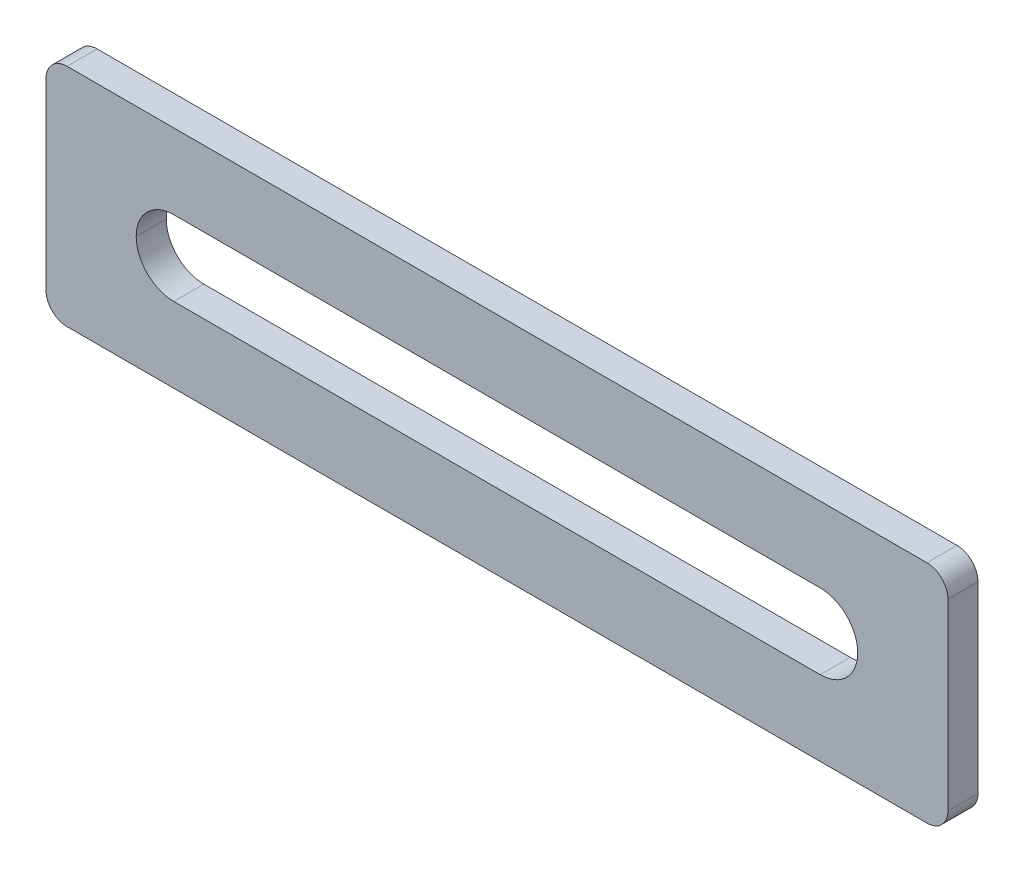
ISO-10303-21;
HEADER;
FILE_DESCRIPTION(('STEP AP214'),'2;1');
FILE_NAME('part.step','',(''),(''),'','','');
FILE_SCHEMA(('AUTOMOTIVE_DESIGN { 1 0 10303 214 1 1 1 1 }'));
ENDSEC;
DATA;
#1=APPLICATION_CONTEXT('core data for automotive mechanical design processes');
#2=APPLICATION_PROTOCOL_DEFINITION('international standard','automotive_design',2000,#1);
#3=PRODUCT_CONTEXT('',#1,'mechanical');
#4=PRODUCT('Part','Part','',(#3));
#5=PRODUCT_RELATED_PRODUCT_CATEGORY('part','',(#4));
#6=PRODUCT_DEFINITION_FORMATION('','',#4);
#7=PRODUCT_DEFINITION_CONTEXT('part definition',#1,'design');
#8=PRODUCT_DEFINITION('design','',#6,#7);
#9=PRODUCT_DEFINITION_SHAPE('','',#8);
#10=(LENGTH_UNIT() NAMED_UNIT(*) SI_UNIT(.MILLI.,.METRE.));
#11=(NAMED_UNIT(*) PLANE_ANGLE_UNIT() SI_UNIT($,.RADIAN.));
#12=(NAMED_UNIT(*) SI_UNIT($,.STERADIAN.) SOLID_ANGLE_UNIT());
#13=UNCERTAINTY_MEASURE_WITH_UNIT(LENGTH_MEASURE(1.E-05),#10,'distance_accuracy_value','');
#14=(GEOMETRIC_REPRESENTATION_CONTEXT(3) GLOBAL_UNCERTAINTY_ASSIGNED_CONTEXT((#13)) GLOBAL_UNIT_ASSIGNED_CONTEXT((#10,
#11,#12)) REPRESENTATION_CONTEXT('',''));
#15=CARTESIAN_POINT('',(0.,0.,0.));
#16=DIRECTION('',(0.,0.,1.));
#17=DIRECTION('',(1.,0.,0.));
#18=AXIS2_PLACEMENT_3D('',#15,#16,#17);
#19=CARTESIAN_POINT('',(0.,0.,2.54));
#20=DIRECTION('',(1.,0.,0.));
#21=DIRECTION('',(0.,0.,-1.));
#22=AXIS2_PLACEMENT_3D('',#19,#20,#21);
#23=PLANE('',#22);
#24=DIRECTION('',(0.,-1.,0.));
#25=VECTOR('',#24,1.);
#26=CARTESIAN_POINT('',(0.,0.,2.54));
#27=LINE('',#26,#25);
#28=CARTESIAN_POINT('',(0.,17.272,2.54));
#29=VERTEX_POINT('',#28);
#30=CARTESIAN_POINT('',(0.,1.778,2.54));
#31=VERTEX_POINT('',#30);
#32=EDGE_CURVE('E174',#29,#31,#27,.T.);
#33=ORIENTED_EDGE('',*,*,#32,.F.);
#34=DIRECTION('',(0.,0.,-1.));
#35=VECTOR('',#34,1.);
#36=CARTESIAN_POINT('',(0.,17.272,2.54));
#37=LINE('',#36,#35);
#38=CARTESIAN_POINT('',(0.,17.272,0.));
#39=VERTEX_POINT('',#38);
#40=EDGE_CURVE('E215',#29,#39,#37,.T.);
#41=ORIENTED_EDGE('',*,*,#40,.T.);
#42=DIRECTION('',(0.,-1.,0.));
#43=VECTOR('',#42,1.);
#44=CARTESIAN_POINT('',(0.,0.,0.));
#45=LINE('',#44,#43);
#46=CARTESIAN_POINT('',(0.,1.778,0.));
#47=VERTEX_POINT('',#46);
#48=EDGE_CURVE('E184',#39,#47,#45,.T.);
#49=ORIENTED_EDGE('',*,*,#48,.T.);
#50=DIRECTION('',(0.,0.,-1.));
#51=VECTOR('',#50,1.);
#52=CARTESIAN_POINT('',(0.,1.778,2.54));
#53=LINE('',#52,#51);
#54=EDGE_CURVE('E210',#47,#31,#53,.F.);
#55=ORIENTED_EDGE('',*,*,#54,.T.);
#56=EDGE_LOOP('',(#33,#41,#49,#55));
#57=FACE_BOUND('',#56,.T.);
#58=ADVANCED_FACE('F33',(#57),#23,.F.);
#59=CARTESIAN_POINT('',(0.,0.,2.54));
#60=DIRECTION('',(0.,1.,0.));
#61=DIRECTION('',(0.,0.,1.));
#62=AXIS2_PLACEMENT_3D('',#59,#60,#61);
#63=PLANE('',#62);
#64=DIRECTION('',(1.,0.,0.));
#65=VECTOR('',#64,1.);
#66=CARTESIAN_POINT('',(0.,0.,2.54));
#67=LINE('',#66,#65);
#68=CARTESIAN_POINT('',(1.778,0.,2.54));
#69=VERTEX_POINT('',#68);
#70=CARTESIAN_POINT('',(74.422,0.,2.54));
#71=VERTEX_POINT('',#70);
#72=EDGE_CURVE('E177',#69,#71,#67,.T.);
#73=ORIENTED_EDGE('',*,*,#72,.F.);
#74=DIRECTION('',(0.,0.,-1.));
#75=VECTOR('',#74,1.);
#76=CARTESIAN_POINT('',(1.778,0.,2.54));
#77=LINE('',#76,#75);
#78=CARTESIAN_POINT('',(1.778,0.,0.));
#79=VERTEX_POINT('',#78);
#80=EDGE_CURVE('E240',#69,#79,#77,.T.);
#81=ORIENTED_EDGE('',*,*,#80,.T.);
#82=DIRECTION('',(1.,0.,0.));
#83=VECTOR('',#82,1.);
#84=CARTESIAN_POINT('',(0.,0.,0.));
#85=LINE('',#84,#83);
#86=CARTESIAN_POINT('',(74.422,0.,0.));
#87=VERTEX_POINT('',#86);
#88=EDGE_CURVE('E187',#79,#87,#85,.T.);
#89=ORIENTED_EDGE('',*,*,#88,.T.);
#90=DIRECTION('',(0.,0.,-1.));
#91=VECTOR('',#90,1.);
#92=CARTESIAN_POINT('',(74.422,0.,2.54));
#93=LINE('',#92,#91);
#94=EDGE_CURVE('E238',#87,#71,#93,.F.);
#95=ORIENTED_EDGE('',*,*,#94,.T.);
#96=EDGE_LOOP('',(#73,#81,#89,#95));
#97=FACE_BOUND('',#96,.T.);
#98=ADVANCED_FACE('F246',(#97),#63,.F.);
#99=CARTESIAN_POINT('',(76.2,0.,2.54));
#100=DIRECTION('',(-1.,0.,0.));
#101=DIRECTION('',(0.,0.,1.));
#102=AXIS2_PLACEMENT_3D('',#99,#100,#101);
#103=PLANE('',#102);
#104=DIRECTION('',(0.,1.,0.));
#105=VECTOR('',#104,1.);
#106=CARTESIAN_POINT('',(76.2,0.,2.54));
#107=LINE('',#106,#105);
#108=CARTESIAN_POINT('',(76.2,1.778,2.54));
#109=VERTEX_POINT('',#108);
#110=CARTESIAN_POINT('',(76.2,17.272,2.54));
#111=VERTEX_POINT('',#110);
#112=EDGE_CURVE('E180',#109,#111,#107,.T.);
#113=ORIENTED_EDGE('',*,*,#112,.F.);
#114=DIRECTION('',(0.,0.,-1.));
#115=VECTOR('',#114,1.);
#116=CARTESIAN_POINT('',(76.2,1.778,2.54));
#117=LINE('',#116,#115);
#118=CARTESIAN_POINT('',(76.2,1.778,0.));
#119=VERTEX_POINT('',#118);
#120=EDGE_CURVE('E11',#109,#119,#117,.T.);
#121=ORIENTED_EDGE('',*,*,#120,.T.);
#122=DIRECTION('',(0.,1.,0.));
#123=VECTOR('',#122,1.);
#124=CARTESIAN_POINT('',(76.2,0.,0.));
#125=LINE('',#124,#123);
#126=CARTESIAN_POINT('',(76.2,17.272,0.));
#127=VERTEX_POINT('',#126);
#128=EDGE_CURVE('E190',#119,#127,#125,.T.);
#129=ORIENTED_EDGE('',*,*,#128,.T.);
#130=DIRECTION('',(0.,0.,-1.));
#131=VECTOR('',#130,1.);
#132=CARTESIAN_POINT('',(76.2,17.272,2.54));
#133=LINE('',#132,#131);
#134=EDGE_CURVE('E41',#127,#111,#133,.F.);
#135=ORIENTED_EDGE('',*,*,#134,.T.);
#136=EDGE_LOOP('',(#113,#121,#129,#135));
#137=FACE_BOUND('',#136,.T.);
#138=ADVANCED_FACE('F257',(#137),#103,.F.);
#139=CARTESIAN_POINT('',(0.,19.05,2.54));
#140=DIRECTION('',(0.,-1.,0.));
#141=DIRECTION('',(0.,0.,-1.));
#142=AXIS2_PLACEMENT_3D('',#139,#140,#141);
#143=PLANE('',#142);
#144=DIRECTION('',(-1.,0.,0.));
#145=VECTOR('',#144,1.);
#146=CARTESIAN_POINT('',(0.,19.05,0.));
#147=LINE('',#146,#145);
#148=CARTESIAN_POINT('',(74.422,19.05,0.));
#149=VERTEX_POINT('',#148);
#150=CARTESIAN_POINT('',(1.778,19.05,0.));
#151=VERTEX_POINT('',#150);
#152=EDGE_CURVE('E178',#149,#151,#147,.T.);
#153=ORIENTED_EDGE('',*,*,#152,.T.);
#154=DIRECTION('',(0.,0.,-1.));
#155=VECTOR('',#154,1.);
#156=CARTESIAN_POINT('',(1.778,19.05,2.54));
#157=LINE('',#156,#155);
#158=CARTESIAN_POINT('',(1.778,19.05,2.54));
#159=VERTEX_POINT('',#158);
#160=EDGE_CURVE('E229',#151,#159,#157,.F.);
#161=ORIENTED_EDGE('',*,*,#160,.T.);
#162=DIRECTION('',(-1.,0.,0.));
#163=VECTOR('',#162,1.);
#164=CARTESIAN_POINT('',(0.,19.05,2.54));
#165=LINE('',#164,#163);
#166=CARTESIAN_POINT('',(74.422,19.05,2.54));
#167=VERTEX_POINT('',#166);
#168=EDGE_CURVE('E158',#167,#159,#165,.T.);
#169=ORIENTED_EDGE('',*,*,#168,.F.);
#170=DIRECTION('',(0.,0.,-1.));
#171=VECTOR('',#170,1.);
#172=CARTESIAN_POINT('',(74.422,19.05,2.54));
#173=LINE('',#172,#171);
#174=EDGE_CURVE('E226',#167,#149,#173,.T.);
#175=ORIENTED_EDGE('',*,*,#174,.T.);
#176=EDGE_LOOP('',(#153,#161,#169,#175));
#177=FACE_BOUND('',#176,.T.);
#178=ADVANCED_FACE('F264',(#177),#143,.F.);
#179=CARTESIAN_POINT('',(0.,0.,2.54));
#180=DIRECTION('',(0.,0.,-1.));
#181=DIRECTION('',(-1.,0.,0.));
#182=AXIS2_PLACEMENT_3D('',#179,#180,#181);
#183=PLANE('',#182);
#184=DIRECTION('',(1.,0.,0.));
#185=VECTOR('',#184,1.);
#186=CARTESIAN_POINT('',(7.62,6.35,2.54));
#187=LINE('',#186,#185);
#188=CARTESIAN_POINT('',(10.795,6.35,2.54));
#189=VERTEX_POINT('',#188);
#190=CARTESIAN_POINT('',(65.405,6.35,2.54));
#191=VERTEX_POINT('',#190);
#192=EDGE_CURVE('E165',#189,#191,#187,.T.);
#193=ORIENTED_EDGE('',*,*,#192,.F.);
#194=CARTESIAN_POINT('',(10.795,9.525,2.54));
#195=DIRECTION('',(0.,0.,-1.));
#196=DIRECTION('',(-1.,0.,0.));
#197=AXIS2_PLACEMENT_3D('',#194,#195,#196);
#198=CIRCLE('',#197,3.175);
#199=CARTESIAN_POINT('',(7.62,9.525,2.54));
#200=VERTEX_POINT('',#199);
#201=EDGE_CURVE('E202',#189,#200,#198,.T.);
#202=ORIENTED_EDGE('',*,*,#201,.T.);
#203=CARTESIAN_POINT('',(10.795,9.525,2.54));
#204=DIRECTION('',(0.,0.,-1.));
#205=DIRECTION('',(-1.,0.,0.));
#206=AXIS2_PLACEMENT_3D('',#203,#204,#205);
#207=CIRCLE('',#206,3.175);
#208=CARTESIAN_POINT('',(10.795,12.7,2.54));
#209=VERTEX_POINT('',#208);
#210=EDGE_CURVE('E163',#200,#209,#207,.T.);
#211=ORIENTED_EDGE('',*,*,#210,.T.);
#212=DIRECTION('',(-1.,0.,0.));
#213=VECTOR('',#212,1.);
#214=CARTESIAN_POINT('',(7.62,12.7,2.54));
#215=LINE('',#214,#213);
#216=CARTESIAN_POINT('',(65.405,12.7,2.54));
#217=VERTEX_POINT('',#216);
#218=EDGE_CURVE('E153',#217,#209,#215,.T.);
#219=ORIENTED_EDGE('',*,*,#218,.F.);
#220=CARTESIAN_POINT('',(65.405,9.525,2.54));
#221=DIRECTION('',(0.,0.,-1.));
#222=DIRECTION('',(-1.,0.,0.));
#223=AXIS2_PLACEMENT_3D('',#220,#221,#222);
#224=CIRCLE('',#223,3.175);
#225=CARTESIAN_POINT('',(68.58,9.525,2.54));
#226=VERTEX_POINT('',#225);
#227=EDGE_CURVE('E135',#217,#226,#224,.T.);
#228=ORIENTED_EDGE('',*,*,#227,.T.);
#229=CARTESIAN_POINT('',(65.405,9.525,2.54));
#230=DIRECTION('',(0.,0.,-1.));
#231=DIRECTION('',(-1.,0.,0.));
#232=AXIS2_PLACEMENT_3D('',#229,#230,#231);
#233=CIRCLE('',#232,3.175);
#234=EDGE_CURVE('E206',#226,#191,#233,.T.);
#235=ORIENTED_EDGE('',*,*,#234,.T.);
#236=EDGE_LOOP('',(#193,#202,#211,#219,#228,#235));
#237=FACE_BOUND('',#236,.T.);
#238=ORIENTED_EDGE('',*,*,#168,.T.);
#239=CARTESIAN_POINT('',(1.778,17.272,2.54));
#240=DIRECTION('',(0.,0.,-1.));
#241=DIRECTION('',(-1.,0.,0.));
#242=AXIS2_PLACEMENT_3D('',#239,#240,#241);
#243=CIRCLE('',#242,1.778);
#244=EDGE_CURVE('E236',#159,#29,#243,.F.);
#245=ORIENTED_EDGE('',*,*,#244,.T.);
#246=ORIENTED_EDGE('',*,*,#32,.T.);
#247=CARTESIAN_POINT('',(1.778,1.778,2.54));
#248=DIRECTION('',(0.,0.,-1.));
#249=DIRECTION('',(-1.,0.,0.));
#250=AXIS2_PLACEMENT_3D('',#247,#248,#249);
#251=CIRCLE('',#250,1.778);
#252=EDGE_CURVE('E234',#31,#69,#251,.F.);
#253=ORIENTED_EDGE('',*,*,#252,.T.);
#254=ORIENTED_EDGE('',*,*,#72,.T.);
#255=CARTESIAN_POINT('',(74.422,1.778,2.54));
#256=DIRECTION('',(0.,0.,-1.));
#257=DIRECTION('',(-1.,0.,0.));
#258=AXIS2_PLACEMENT_3D('',#255,#256,#257);
#259=CIRCLE('',#258,1.778);
#260=EDGE_CURVE('E54',#71,#109,#259,.F.);
#261=ORIENTED_EDGE('',*,*,#260,.T.);
#262=ORIENTED_EDGE('',*,*,#112,.T.);
#263=CARTESIAN_POINT('',(74.422,17.272,2.54));
#264=DIRECTION('',(0.,0.,-1.));
#265=DIRECTION('',(-1.,0.,0.));
#266=AXIS2_PLACEMENT_3D('',#263,#264,#265);
#267=CIRCLE('',#266,1.778);
#268=EDGE_CURVE('E231',#111,#167,#267,.F.);
#269=ORIENTED_EDGE('',*,*,#268,.T.);
#270=EDGE_LOOP('',(#238,#245,#246,#253,#254,#261,#262,#269));
#271=FACE_BOUND('',#270,.T.);
#272=ADVANCED_FACE('F161',(#237,#271),#183,.F.);
#273=CARTESIAN_POINT('',(0.,0.,0.));
#274=DIRECTION('',(0.,0.,-1.));
#275=DIRECTION('',(-1.,0.,0.));
#276=AXIS2_PLACEMENT_3D('',#273,#274,#275);
#277=PLANE('',#276);
#278=CARTESIAN_POINT('',(10.795,9.525,0.));
#279=DIRECTION('',(0.,0.,-1.));
#280=DIRECTION('',(-1.,0.,0.));
#281=AXIS2_PLACEMENT_3D('',#278,#279,#280);
#282=CIRCLE('',#281,3.175);
#283=CARTESIAN_POINT('',(10.795,12.7,0.));
#284=VERTEX_POINT('',#283);
#285=CARTESIAN_POINT('',(7.62,9.525,0.));
#286=VERTEX_POINT('',#285);
#287=EDGE_CURVE('E200',#284,#286,#282,.F.);
#288=ORIENTED_EDGE('',*,*,#287,.T.);
#289=CARTESIAN_POINT('',(10.795,9.525,0.));
#290=DIRECTION('',(0.,0.,-1.));
#291=DIRECTION('',(-1.,0.,0.));
#292=AXIS2_PLACEMENT_3D('',#289,#290,#291);
#293=CIRCLE('',#292,3.175);
#294=CARTESIAN_POINT('',(10.795,6.35,0.));
#295=VERTEX_POINT('',#294);
#296=EDGE_CURVE('E146',#286,#295,#293,.F.);
#297=ORIENTED_EDGE('',*,*,#296,.T.);
#298=DIRECTION('',(1.,0.,0.));
#299=VECTOR('',#298,1.);
#300=CARTESIAN_POINT('',(7.62,6.35,0.));
#301=LINE('',#300,#299);
#302=CARTESIAN_POINT('',(65.405,6.35,0.));
#303=VERTEX_POINT('',#302);
#304=EDGE_CURVE('E164',#295,#303,#301,.T.);
#305=ORIENTED_EDGE('',*,*,#304,.T.);
#306=CARTESIAN_POINT('',(65.405,9.525,0.));
#307=DIRECTION('',(0.,0.,-1.));
#308=DIRECTION('',(-1.,0.,0.));
#309=AXIS2_PLACEMENT_3D('',#306,#307,#308);
#310=CIRCLE('',#309,3.175);
#311=CARTESIAN_POINT('',(68.58,9.525,0.));
#312=VERTEX_POINT('',#311);
#313=EDGE_CURVE('E208',#303,#312,#310,.F.);
#314=ORIENTED_EDGE('',*,*,#313,.T.);
#315=CARTESIAN_POINT('',(65.405,9.525,0.));
#316=DIRECTION('',(0.,0.,-1.));
#317=DIRECTION('',(-1.,0.,0.));
#318=AXIS2_PLACEMENT_3D('',#315,#316,#317);
#319=CIRCLE('',#318,3.175);
#320=CARTESIAN_POINT('',(65.405,12.7,0.));
#321=VERTEX_POINT('',#320);
#322=EDGE_CURVE('E145',#312,#321,#319,.F.);
#323=ORIENTED_EDGE('',*,*,#322,.T.);
#324=DIRECTION('',(-1.,0.,0.));
#325=VECTOR('',#324,1.);
#326=CARTESIAN_POINT('',(7.62,12.7,0.));
#327=LINE('',#326,#325);
#328=EDGE_CURVE('E156',#321,#284,#327,.T.);
#329=ORIENTED_EDGE('',*,*,#328,.T.);
#330=EDGE_LOOP('',(#288,#297,#305,#314,#323,#329));
#331=FACE_BOUND('',#330,.T.);
#332=ORIENTED_EDGE('',*,*,#48,.F.);
#333=CARTESIAN_POINT('',(1.778,17.272,0.));
#334=DIRECTION('',(0.,0.,-1.));
#335=DIRECTION('',(-1.,0.,0.));
#336=AXIS2_PLACEMENT_3D('',#333,#334,#335);
#337=CIRCLE('',#336,1.778);
#338=EDGE_CURVE('E224',#39,#151,#337,.T.);
#339=ORIENTED_EDGE('',*,*,#338,.T.);
#340=ORIENTED_EDGE('',*,*,#152,.F.);
#341=CARTESIAN_POINT('',(74.422,17.272,0.));
#342=DIRECTION('',(0.,0.,-1.));
#343=DIRECTION('',(-1.,0.,0.));
#344=AXIS2_PLACEMENT_3D('',#341,#342,#343);
#345=CIRCLE('',#344,1.778);
#346=EDGE_CURVE('E218',#149,#127,#345,.T.);
#347=ORIENTED_EDGE('',*,*,#346,.T.);
#348=ORIENTED_EDGE('',*,*,#128,.F.);
#349=CARTESIAN_POINT('',(74.422,1.778,0.));
#350=DIRECTION('',(0.,0.,-1.));
#351=DIRECTION('',(-1.,0.,0.));
#352=AXIS2_PLACEMENT_3D('',#349,#350,#351);
#353=CIRCLE('',#352,1.778);
#354=EDGE_CURVE('E220',#119,#87,#353,.T.);
#355=ORIENTED_EDGE('',*,*,#354,.T.);
#356=ORIENTED_EDGE('',*,*,#88,.F.);
#357=CARTESIAN_POINT('',(1.778,1.778,0.));
#358=DIRECTION('',(0.,0.,-1.));
#359=DIRECTION('',(-1.,0.,0.));
#360=AXIS2_PLACEMENT_3D('',#357,#358,#359);
#361=CIRCLE('',#360,1.778);
#362=EDGE_CURVE('E222',#79,#47,#361,.T.);
#363=ORIENTED_EDGE('',*,*,#362,.T.);
#364=EDGE_LOOP('',(#332,#339,#340,#347,#348,#355,#356,#363));
#365=FACE_BOUND('',#364,.T.);
#366=ADVANCED_FACE('F252',(#331,#365),#277,.T.);
#367=CARTESIAN_POINT('',(7.62,12.7,0.));
#368=DIRECTION('',(0.,1.,0.));
#369=DIRECTION('',(0.,0.,1.));
#370=AXIS2_PLACEMENT_3D('',#367,#368,#369);
#371=PLANE('',#370);
#372=ORIENTED_EDGE('',*,*,#218,.T.);
#373=DIRECTION('',(0.,0.,1.));
#374=VECTOR('',#373,1.);
#375=CARTESIAN_POINT('',(10.795,12.7,0.));
#376=LINE('',#375,#374);
#377=EDGE_CURVE('E157',#209,#284,#376,.F.);
#378=ORIENTED_EDGE('',*,*,#377,.T.);
#379=ORIENTED_EDGE('',*,*,#328,.F.);
#380=DIRECTION('',(0.,0.,1.));
#381=VECTOR('',#380,1.);
#382=CARTESIAN_POINT('',(65.405,12.7,2.54));
#383=LINE('',#382,#381);
#384=EDGE_CURVE('E139',#321,#217,#383,.T.);
#385=ORIENTED_EDGE('',*,*,#384,.T.);
#386=EDGE_LOOP('',(#372,#378,#379,#385));
#387=FACE_BOUND('',#386,.T.);
#388=ADVANCED_FACE('F151',(#387),#371,.F.);
#389=CARTESIAN_POINT('',(7.62,6.35,0.));
#390=DIRECTION('',(0.,-1.,0.));
#391=DIRECTION('',(0.,0.,-1.));
#392=AXIS2_PLACEMENT_3D('',#389,#390,#391);
#393=PLANE('',#392);
#394=ORIENTED_EDGE('',*,*,#304,.F.);
#395=DIRECTION('',(0.,0.,1.));
#396=VECTOR('',#395,1.);
#397=CARTESIAN_POINT('',(10.795,6.35,2.54));
#398=LINE('',#397,#396);
#399=EDGE_CURVE('E197',#295,#189,#398,.T.);
#400=ORIENTED_EDGE('',*,*,#399,.T.);
#401=ORIENTED_EDGE('',*,*,#192,.T.);
#402=DIRECTION('',(0.,0.,1.));
#403=VECTOR('',#402,1.);
#404=CARTESIAN_POINT('',(65.405,6.35,0.));
#405=LINE('',#404,#403);
#406=EDGE_CURVE('E195',#191,#303,#405,.F.);
#407=ORIENTED_EDGE('',*,*,#406,.T.);
#408=EDGE_LOOP('',(#394,#400,#401,#407));
#409=FACE_BOUND('',#408,.T.);
#410=ADVANCED_FACE('F297',(#409),#393,.F.);
#411=CARTESIAN_POINT('',(10.795,9.525,0.));
#412=DIRECTION('',(0.,0.,-1.));
#413=DIRECTION('',(-1.,0.,0.));
#414=AXIS2_PLACEMENT_3D('',#411,#412,#413);
#415=CYLINDRICAL_SURFACE('',#414,3.175);
#416=ORIENTED_EDGE('',*,*,#399,.F.);
#417=ORIENTED_EDGE('',*,*,#296,.F.);
#418=DIRECTION('',(0.,0.,1.));
#419=VECTOR('',#418,1.);
#420=CARTESIAN_POINT('',(7.62,9.525,0.));
#421=LINE('',#420,#419);
#422=EDGE_CURVE('E170',#200,#286,#421,.F.);
#423=ORIENTED_EDGE('',*,*,#422,.F.);
#424=ORIENTED_EDGE('',*,*,#201,.F.);
#425=EDGE_LOOP('',(#416,#417,#423,#424));
#426=FACE_BOUND('',#425,.T.);
#427=ADVANCED_FACE('F293',(#426),#415,.F.);
#428=CARTESIAN_POINT('',(10.795,9.525,0.));
#429=DIRECTION('',(0.,0.,-1.));
#430=DIRECTION('',(-1.,0.,0.));
#431=AXIS2_PLACEMENT_3D('',#428,#429,#430);
#432=CYLINDRICAL_SURFACE('',#431,3.175);
#433=ORIENTED_EDGE('',*,*,#287,.F.);
#434=ORIENTED_EDGE('',*,*,#377,.F.);
#435=ORIENTED_EDGE('',*,*,#210,.F.);
#436=ORIENTED_EDGE('',*,*,#422,.T.);
#437=EDGE_LOOP('',(#433,#434,#435,#436));
#438=FACE_BOUND('',#437,.T.);
#439=ADVANCED_FACE('F289',(#438),#432,.F.);
#440=CARTESIAN_POINT('',(65.405,9.525,0.));
#441=DIRECTION('',(0.,0.,-1.));
#442=DIRECTION('',(-1.,0.,0.));
#443=AXIS2_PLACEMENT_3D('',#440,#441,#442);
#444=CYLINDRICAL_SURFACE('',#443,3.175);
#445=DIRECTION('',(0.,0.,1.));
#446=VECTOR('',#445,1.);
#447=CARTESIAN_POINT('',(68.58,9.525,2.54));
#448=LINE('',#447,#446);
#449=EDGE_CURVE('E141',#312,#226,#448,.T.);
#450=ORIENTED_EDGE('',*,*,#449,.F.);
#451=ORIENTED_EDGE('',*,*,#313,.F.);
#452=ORIENTED_EDGE('',*,*,#406,.F.);
#453=ORIENTED_EDGE('',*,*,#234,.F.);
#454=EDGE_LOOP('',(#450,#451,#452,#453));
#455=FACE_BOUND('',#454,.T.);
#456=ADVANCED_FACE('F292',(#455),#444,.F.);
#457=CARTESIAN_POINT('',(65.405,9.525,0.));
#458=DIRECTION('',(0.,0.,-1.));
#459=DIRECTION('',(-1.,0.,0.));
#460=AXIS2_PLACEMENT_3D('',#457,#458,#459);
#461=CYLINDRICAL_SURFACE('',#460,3.175);
#462=ORIENTED_EDGE('',*,*,#322,.F.);
#463=ORIENTED_EDGE('',*,*,#449,.T.);
#464=ORIENTED_EDGE('',*,*,#227,.F.);
#465=ORIENTED_EDGE('',*,*,#384,.F.);
#466=EDGE_LOOP('',(#462,#463,#464,#465));
#467=FACE_BOUND('',#466,.T.);
#468=ADVANCED_FACE('F138',(#467),#461,.F.);
#469=CARTESIAN_POINT('',(1.778,17.272,2.54));
#470=DIRECTION('',(0.,0.,-1.));
#471=DIRECTION('',(-1.,0.,0.));
#472=AXIS2_PLACEMENT_3D('',#469,#470,#471);
#473=CYLINDRICAL_SURFACE('',#472,1.778);
#474=ORIENTED_EDGE('',*,*,#244,.F.);
#475=ORIENTED_EDGE('',*,*,#160,.F.);
#476=ORIENTED_EDGE('',*,*,#338,.F.);
#477=ORIENTED_EDGE('',*,*,#40,.F.);
#478=EDGE_LOOP('',(#474,#475,#476,#477));
#479=FACE_BOUND('',#478,.T.);
#480=ADVANCED_FACE('F269',(#479),#473,.T.);
#481=CARTESIAN_POINT('',(1.778,1.778,2.54));
#482=DIRECTION('',(0.,0.,-1.));
#483=DIRECTION('',(-1.,0.,0.));
#484=AXIS2_PLACEMENT_3D('',#481,#482,#483);
#485=CYLINDRICAL_SURFACE('',#484,1.778);
#486=ORIENTED_EDGE('',*,*,#252,.F.);
#487=ORIENTED_EDGE('',*,*,#54,.F.);
#488=ORIENTED_EDGE('',*,*,#362,.F.);
#489=ORIENTED_EDGE('',*,*,#80,.F.);
#490=EDGE_LOOP('',(#486,#487,#488,#489));
#491=FACE_BOUND('',#490,.T.);
#492=ADVANCED_FACE('F273',(#491),#485,.T.);
#493=CARTESIAN_POINT('',(74.422,1.778,2.54));
#494=DIRECTION('',(0.,0.,-1.));
#495=DIRECTION('',(-1.,0.,0.));
#496=AXIS2_PLACEMENT_3D('',#493,#494,#495);
#497=CYLINDRICAL_SURFACE('',#496,1.778);
#498=ORIENTED_EDGE('',*,*,#260,.F.);
#499=ORIENTED_EDGE('',*,*,#94,.F.);
#500=ORIENTED_EDGE('',*,*,#354,.F.);
#501=ORIENTED_EDGE('',*,*,#120,.F.);
#502=EDGE_LOOP('',(#498,#499,#500,#501));
#503=FACE_BOUND('',#502,.T.);
#504=ADVANCED_FACE('F256',(#503),#497,.T.);
#505=CARTESIAN_POINT('',(74.422,17.272,2.54));
#506=DIRECTION('',(0.,0.,-1.));
#507=DIRECTION('',(-1.,0.,0.));
#508=AXIS2_PLACEMENT_3D('',#505,#506,#507);
#509=CYLINDRICAL_SURFACE('',#508,1.778);
#510=ORIENTED_EDGE('',*,*,#268,.F.);
#511=ORIENTED_EDGE('',*,*,#134,.F.);
#512=ORIENTED_EDGE('',*,*,#346,.F.);
#513=ORIENTED_EDGE('',*,*,#174,.F.);
#514=EDGE_LOOP('',(#510,#511,#512,#513));
#515=FACE_BOUND('',#514,.T.);
#516=ADVANCED_FACE('F35',(#515),#509,.T.);
#517=CLOSED_SHELL('',(#58,#98,#138,#178,#272,#366,#388,#410,#427,#439,#456,#468,#480,#492,#504,#516));
#518=MANIFOLD_SOLID_BREP('B2',#517);
#519=ADVANCED_BREP_SHAPE_REPRESENTATION('',(#18,#518),#14);
#520=SHAPE_DEFINITION_REPRESENTATION(#9,#519);
ENDSEC;
END-ISO-10303-21;
